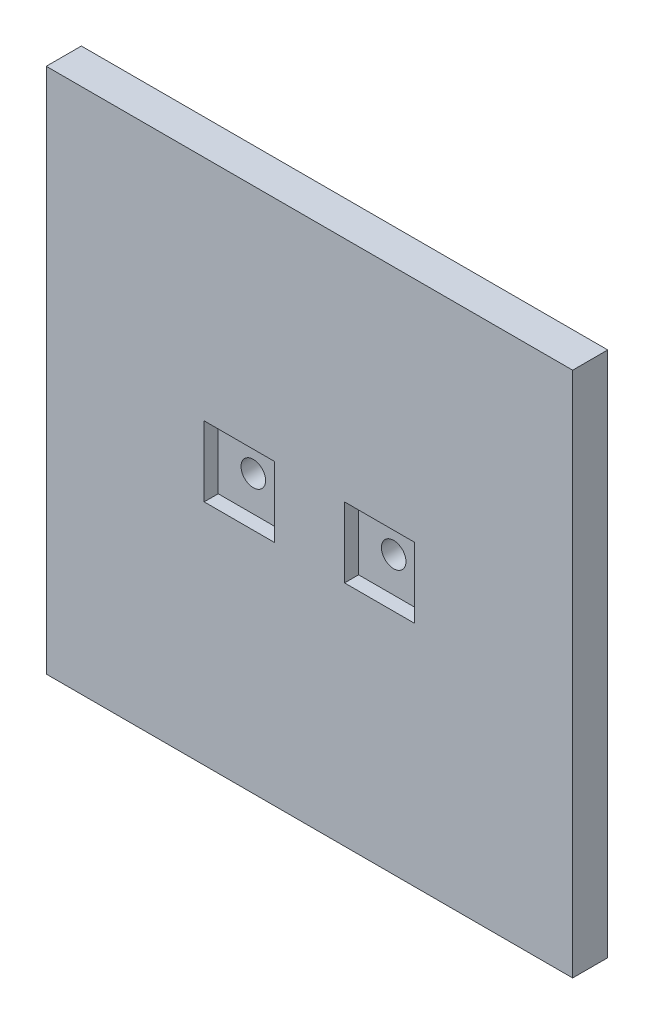
ISO-10303-21;
HEADER;
FILE_DESCRIPTION(('STEP AP214'),'2;1');
FILE_NAME('part.step','',(''),(''),'','','');
FILE_SCHEMA(('AUTOMOTIVE_DESIGN { 1 0 10303 214 1 1 1 1 }'));
ENDSEC;
DATA;
#1=APPLICATION_CONTEXT('core data for automotive mechanical design processes');
#2=APPLICATION_PROTOCOL_DEFINITION('international standard','automotive_design',2000,#1);
#3=PRODUCT_CONTEXT('',#1,'mechanical');
#4=PRODUCT('Part','Part','',(#3));
#5=PRODUCT_RELATED_PRODUCT_CATEGORY('part','',(#4));
#6=PRODUCT_DEFINITION_FORMATION('','',#4);
#7=PRODUCT_DEFINITION_CONTEXT('part definition',#1,'design');
#8=PRODUCT_DEFINITION('design','',#6,#7);
#9=PRODUCT_DEFINITION_SHAPE('','',#8);
#10=(LENGTH_UNIT() NAMED_UNIT(*) SI_UNIT(.MILLI.,.METRE.));
#11=(NAMED_UNIT(*) PLANE_ANGLE_UNIT() SI_UNIT($,.RADIAN.));
#12=(NAMED_UNIT(*) SI_UNIT($,.STERADIAN.) SOLID_ANGLE_UNIT());
#13=UNCERTAINTY_MEASURE_WITH_UNIT(LENGTH_MEASURE(1.E-05),#10,'distance_accuracy_value','');
#14=(GEOMETRIC_REPRESENTATION_CONTEXT(3) GLOBAL_UNCERTAINTY_ASSIGNED_CONTEXT((#13)) GLOBAL_UNIT_ASSIGNED_CONTEXT((#10,
#11,#12)) REPRESENTATION_CONTEXT('',''));
#15=CARTESIAN_POINT('',(0.,0.,0.));
#16=DIRECTION('',(0.,0.,1.));
#17=DIRECTION('',(1.,0.,0.));
#18=AXIS2_PLACEMENT_3D('',#15,#16,#17);
#19=CARTESIAN_POINT('',(5.,0.,5.));
#20=DIRECTION('',(-1.,0.,0.));
#21=DIRECTION('',(0.,0.,1.));
#22=AXIS2_PLACEMENT_3D('',#19,#20,#21);
#23=PLANE('',#22);
#24=DIRECTION('',(0.,0.,-1.));
#25=VECTOR('',#24,1.);
#26=CARTESIAN_POINT('',(5.,-5.,5.));
#27=LINE('',#26,#25);
#28=CARTESIAN_POINT('',(5.,-5.,5.));
#29=VERTEX_POINT('',#28);
#30=CARTESIAN_POINT('',(5.,-5.,3.));
#31=VERTEX_POINT('',#30);
#32=EDGE_CURVE('E220',#29,#31,#27,.T.);
#33=ORIENTED_EDGE('',*,*,#32,.T.);
#34=DIRECTION('',(0.,1.,0.));
#35=VECTOR('',#34,1.);
#36=CARTESIAN_POINT('',(5.,0.,3.));
#37=LINE('',#36,#35);
#38=CARTESIAN_POINT('',(5.,5.,3.));
#39=VERTEX_POINT('',#38);
#40=EDGE_CURVE('E58',#31,#39,#37,.T.);
#41=ORIENTED_EDGE('',*,*,#40,.T.);
#42=DIRECTION('',(0.,0.,-1.));
#43=VECTOR('',#42,1.);
#44=CARTESIAN_POINT('',(5.,5.,5.));
#45=LINE('',#44,#43);
#46=CARTESIAN_POINT('',(5.,5.,5.));
#47=VERTEX_POINT('',#46);
#48=EDGE_CURVE('E11',#47,#39,#45,.T.);
#49=ORIENTED_EDGE('',*,*,#48,.F.);
#50=DIRECTION('',(0.,1.,0.));
#51=VECTOR('',#50,1.);
#52=CARTESIAN_POINT('',(5.,0.,5.));
#53=LINE('',#52,#51);
#54=EDGE_CURVE('E206',#29,#47,#53,.T.);
#55=ORIENTED_EDGE('',*,*,#54,.F.);
#56=EDGE_LOOP('',(#33,#41,#49,#55));
#57=FACE_BOUND('',#56,.T.);
#58=ADVANCED_FACE('F41',(#57),#23,.F.);
#59=CARTESIAN_POINT('',(0.,5.,5.));
#60=DIRECTION('',(0.,-1.,0.));
#61=DIRECTION('',(1.,0.,0.));
#62=AXIS2_PLACEMENT_3D('',#59,#60,#61);
#63=PLANE('',#62);
#64=DIRECTION('',(1.,0.,0.));
#65=VECTOR('',#64,1.);
#66=CARTESIAN_POINT('',(0.,5.,3.));
#67=LINE('',#66,#65);
#68=CARTESIAN_POINT('',(15.,5.,3.));
#69=VERTEX_POINT('',#68);
#70=EDGE_CURVE('E64',#39,#69,#67,.T.);
#71=ORIENTED_EDGE('',*,*,#70,.T.);
#72=DIRECTION('',(0.,0.,-1.));
#73=VECTOR('',#72,1.);
#74=CARTESIAN_POINT('',(15.,5.,5.));
#75=LINE('',#74,#73);
#76=CARTESIAN_POINT('',(15.,5.,5.));
#77=VERTEX_POINT('',#76);
#78=EDGE_CURVE('E50',#77,#69,#75,.T.);
#79=ORIENTED_EDGE('',*,*,#78,.F.);
#80=DIRECTION('',(-1.,0.,0.));
#81=VECTOR('',#80,1.);
#82=CARTESIAN_POINT('',(0.,5.,5.));
#83=LINE('',#82,#81);
#84=EDGE_CURVE('E188',#77,#47,#83,.T.);
#85=ORIENTED_EDGE('',*,*,#84,.T.);
#86=ORIENTED_EDGE('',*,*,#48,.T.);
#87=EDGE_LOOP('',(#71,#79,#85,#86));
#88=FACE_BOUND('',#87,.T.);
#89=ADVANCED_FACE('F255',(#88),#63,.T.);
#90=CARTESIAN_POINT('',(15.,0.,5.));
#91=DIRECTION('',(1.,0.,0.));
#92=DIRECTION('',(0.,0.,-1.));
#93=AXIS2_PLACEMENT_3D('',#90,#91,#92);
#94=PLANE('',#93);
#95=ORIENTED_EDGE('',*,*,#78,.T.);
#96=DIRECTION('',(0.,-1.,0.));
#97=VECTOR('',#96,1.);
#98=CARTESIAN_POINT('',(15.,0.,3.));
#99=LINE('',#98,#97);
#100=CARTESIAN_POINT('',(15.,-5.,3.));
#101=VERTEX_POINT('',#100);
#102=EDGE_CURVE('E173',#69,#101,#99,.T.);
#103=ORIENTED_EDGE('',*,*,#102,.T.);
#104=DIRECTION('',(0.,0.,-1.));
#105=VECTOR('',#104,1.);
#106=CARTESIAN_POINT('',(15.,-5.,5.));
#107=LINE('',#106,#105);
#108=CARTESIAN_POINT('',(15.,-5.,5.));
#109=VERTEX_POINT('',#108);
#110=EDGE_CURVE('E222',#109,#101,#107,.T.);
#111=ORIENTED_EDGE('',*,*,#110,.F.);
#112=DIRECTION('',(0.,-1.,0.));
#113=VECTOR('',#112,1.);
#114=CARTESIAN_POINT('',(15.,0.,5.));
#115=LINE('',#114,#113);
#116=EDGE_CURVE('E208',#77,#109,#115,.T.);
#117=ORIENTED_EDGE('',*,*,#116,.F.);
#118=EDGE_LOOP('',(#95,#103,#111,#117));
#119=FACE_BOUND('',#118,.T.);
#120=ADVANCED_FACE('F260',(#119),#94,.F.);
#121=CARTESIAN_POINT('',(37.5,0.,5.));
#122=DIRECTION('',(1.,0.,0.));
#123=DIRECTION('',(0.,1.,0.));
#124=AXIS2_PLACEMENT_3D('',#121,#122,#123);
#125=PLANE('',#124);
#126=DIRECTION('',(0.,-1.,0.));
#127=VECTOR('',#126,1.);
#128=CARTESIAN_POINT('',(37.5,0.,0.));
#129=LINE('',#128,#127);
#130=CARTESIAN_POINT('',(37.5,37.5,0.));
#131=VERTEX_POINT('',#130);
#132=CARTESIAN_POINT('',(37.5,-37.5,0.));
#133=VERTEX_POINT('',#132);
#134=EDGE_CURVE('E166',#131,#133,#129,.T.);
#135=ORIENTED_EDGE('',*,*,#134,.F.);
#136=DIRECTION('',(0.,0.,-1.));
#137=VECTOR('',#136,1.);
#138=CARTESIAN_POINT('',(37.5,37.5,5.));
#139=LINE('',#138,#137);
#140=CARTESIAN_POINT('',(37.5,37.5,5.));
#141=VERTEX_POINT('',#140);
#142=EDGE_CURVE('E223',#141,#131,#139,.T.);
#143=ORIENTED_EDGE('',*,*,#142,.F.);
#144=DIRECTION('',(0.,-1.,0.));
#145=VECTOR('',#144,1.);
#146=CARTESIAN_POINT('',(37.5,0.,5.));
#147=LINE('',#146,#145);
#148=CARTESIAN_POINT('',(37.5,-37.5,5.));
#149=VERTEX_POINT('',#148);
#150=EDGE_CURVE('E195',#141,#149,#147,.T.);
#151=ORIENTED_EDGE('',*,*,#150,.T.);
#152=DIRECTION('',(0.,0.,-1.));
#153=VECTOR('',#152,1.);
#154=CARTESIAN_POINT('',(37.5,-37.5,5.));
#155=LINE('',#154,#153);
#156=EDGE_CURVE('E226',#149,#133,#155,.T.);
#157=ORIENTED_EDGE('',*,*,#156,.T.);
#158=EDGE_LOOP('',(#135,#143,#151,#157));
#159=FACE_BOUND('',#158,.T.);
#160=ADVANCED_FACE('F297',(#159),#125,.T.);
#161=CARTESIAN_POINT('',(0.,37.5,5.));
#162=DIRECTION('',(0.,1.,0.));
#163=DIRECTION('',(0.,0.,1.));
#164=AXIS2_PLACEMENT_3D('',#161,#162,#163);
#165=PLANE('',#164);
#166=DIRECTION('',(1.,0.,0.));
#167=VECTOR('',#166,1.);
#168=CARTESIAN_POINT('',(0.,37.5,0.));
#169=LINE('',#168,#167);
#170=CARTESIAN_POINT('',(-37.5,37.5,0.));
#171=VERTEX_POINT('',#170);
#172=EDGE_CURVE('E212',#171,#131,#169,.T.);
#173=ORIENTED_EDGE('',*,*,#172,.F.);
#174=DIRECTION('',(0.,0.,-1.));
#175=VECTOR('',#174,1.);
#176=CARTESIAN_POINT('',(-37.5,37.5,5.));
#177=LINE('',#176,#175);
#178=CARTESIAN_POINT('',(-37.5,37.5,5.));
#179=VERTEX_POINT('',#178);
#180=EDGE_CURVE('E231',#179,#171,#177,.T.);
#181=ORIENTED_EDGE('',*,*,#180,.F.);
#182=DIRECTION('',(1.,0.,0.));
#183=VECTOR('',#182,1.);
#184=CARTESIAN_POINT('',(0.,37.5,5.));
#185=LINE('',#184,#183);
#186=EDGE_CURVE('E198',#179,#141,#185,.T.);
#187=ORIENTED_EDGE('',*,*,#186,.T.);
#188=ORIENTED_EDGE('',*,*,#142,.T.);
#189=EDGE_LOOP('',(#173,#181,#187,#188));
#190=FACE_BOUND('',#189,.T.);
#191=ADVANCED_FACE('F293',(#190),#165,.T.);
#192=CARTESIAN_POINT('',(-37.5,0.,5.));
#193=DIRECTION('',(1.,0.,0.));
#194=DIRECTION('',(0.,1.,0.));
#195=AXIS2_PLACEMENT_3D('',#192,#193,#194);
#196=PLANE('',#195);
#197=DIRECTION('',(0.,-1.,0.));
#198=VECTOR('',#197,1.);
#199=CARTESIAN_POINT('',(-37.5,0.,0.));
#200=LINE('',#199,#198);
#201=CARTESIAN_POINT('',(-37.5,-37.5,0.));
#202=VERTEX_POINT('',#201);
#203=EDGE_CURVE('E215',#171,#202,#200,.T.);
#204=ORIENTED_EDGE('',*,*,#203,.T.);
#205=DIRECTION('',(0.,0.,-1.));
#206=VECTOR('',#205,1.);
#207=CARTESIAN_POINT('',(-37.5,-37.5,5.));
#208=LINE('',#207,#206);
#209=CARTESIAN_POINT('',(-37.5,-37.5,5.));
#210=VERTEX_POINT('',#209);
#211=EDGE_CURVE('E228',#210,#202,#208,.T.);
#212=ORIENTED_EDGE('',*,*,#211,.F.);
#213=DIRECTION('',(0.,-1.,0.));
#214=VECTOR('',#213,1.);
#215=CARTESIAN_POINT('',(-37.5,0.,5.));
#216=LINE('',#215,#214);
#217=EDGE_CURVE('E201',#179,#210,#216,.T.);
#218=ORIENTED_EDGE('',*,*,#217,.F.);
#219=ORIENTED_EDGE('',*,*,#180,.T.);
#220=EDGE_LOOP('',(#204,#212,#218,#219));
#221=FACE_BOUND('',#220,.T.);
#222=ADVANCED_FACE('F290',(#221),#196,.F.);
#223=DIRECTION('',(-1.,0.,0.));
#224=VECTOR('',#223,1.);
#225=CARTESIAN_POINT('',(0.,5.,3.));
#226=LINE('',#225,#224);
#227=CARTESIAN_POINT('',(-5.,5.,3.));
#228=VERTEX_POINT('',#227);
#229=CARTESIAN_POINT('',(-15.,5.,3.));
#230=VERTEX_POINT('',#229);
#231=EDGE_CURVE('E157',#228,#230,#226,.T.);
#232=ORIENTED_EDGE('',*,*,#231,.F.);
#233=DIRECTION('',(0.,0.,-1.));
#234=VECTOR('',#233,1.);
#235=CARTESIAN_POINT('',(-5.,5.,5.));
#236=LINE('',#235,#234);
#237=CARTESIAN_POINT('',(-5.,5.,5.));
#238=VERTEX_POINT('',#237);
#239=EDGE_CURVE('E45',#238,#228,#236,.T.);
#240=ORIENTED_EDGE('',*,*,#239,.F.);
#241=CARTESIAN_POINT('',(-15.,5.,5.));
#242=VERTEX_POINT('',#241);
#243=EDGE_CURVE('E183',#238,#242,#83,.T.);
#244=ORIENTED_EDGE('',*,*,#243,.T.);
#245=DIRECTION('',(0.,0.,-1.));
#246=VECTOR('',#245,1.);
#247=CARTESIAN_POINT('',(-15.,5.,5.));
#248=LINE('',#247,#246);
#249=EDGE_CURVE('E144',#242,#230,#248,.T.);
#250=ORIENTED_EDGE('',*,*,#249,.T.);
#251=EDGE_LOOP('',(#232,#240,#244,#250));
#252=FACE_BOUND('',#251,.T.);
#253=ADVANCED_FACE('F239',(#252),#63,.T.);
#254=CARTESIAN_POINT('',(-5.,0.,5.));
#255=DIRECTION('',(-1.,0.,0.));
#256=DIRECTION('',(0.,0.,1.));
#257=AXIS2_PLACEMENT_3D('',#254,#255,#256);
#258=PLANE('',#257);
#259=DIRECTION('',(0.,1.,0.));
#260=VECTOR('',#259,1.);
#261=CARTESIAN_POINT('',(-5.,0.,3.));
#262=LINE('',#261,#260);
#263=CARTESIAN_POINT('',(-5.,-5.,3.));
#264=VERTEX_POINT('',#263);
#265=EDGE_CURVE('E152',#264,#228,#262,.T.);
#266=ORIENTED_EDGE('',*,*,#265,.F.);
#267=DIRECTION('',(0.,0.,-1.));
#268=VECTOR('',#267,1.);
#269=CARTESIAN_POINT('',(-5.,-5.,5.));
#270=LINE('',#269,#268);
#271=CARTESIAN_POINT('',(-5.,-5.,5.));
#272=VERTEX_POINT('',#271);
#273=EDGE_CURVE('E143',#272,#264,#270,.T.);
#274=ORIENTED_EDGE('',*,*,#273,.F.);
#275=DIRECTION('',(0.,1.,0.));
#276=VECTOR('',#275,1.);
#277=CARTESIAN_POINT('',(-5.,0.,5.));
#278=LINE('',#277,#276);
#279=EDGE_CURVE('E186',#272,#238,#278,.T.);
#280=ORIENTED_EDGE('',*,*,#279,.T.);
#281=ORIENTED_EDGE('',*,*,#239,.T.);
#282=EDGE_LOOP('',(#266,#274,#280,#281));
#283=FACE_BOUND('',#282,.T.);
#284=ADVANCED_FACE('F43',(#283),#258,.T.);
#285=CARTESIAN_POINT('',(0.,-5.,5.));
#286=DIRECTION('',(0.,1.,0.));
#287=DIRECTION('',(0.,0.,1.));
#288=AXIS2_PLACEMENT_3D('',#285,#286,#287);
#289=PLANE('',#288);
#290=DIRECTION('',(-1.,0.,0.));
#291=VECTOR('',#290,1.);
#292=CARTESIAN_POINT('',(0.,-5.,3.));
#293=LINE('',#292,#291);
#294=CARTESIAN_POINT('',(-15.,-5.,3.));
#295=VERTEX_POINT('',#294);
#296=EDGE_CURVE('E148',#264,#295,#293,.T.);
#297=ORIENTED_EDGE('',*,*,#296,.T.);
#298=DIRECTION('',(0.,0.,-1.));
#299=VECTOR('',#298,1.);
#300=CARTESIAN_POINT('',(-15.,-5.,5.));
#301=LINE('',#300,#299);
#302=CARTESIAN_POINT('',(-15.,-5.,5.));
#303=VERTEX_POINT('',#302);
#304=EDGE_CURVE('E132',#303,#295,#301,.T.);
#305=ORIENTED_EDGE('',*,*,#304,.F.);
#306=DIRECTION('',(1.,0.,0.));
#307=VECTOR('',#306,1.);
#308=CARTESIAN_POINT('',(0.,-5.,5.));
#309=LINE('',#308,#307);
#310=EDGE_CURVE('E191',#303,#272,#309,.T.);
#311=ORIENTED_EDGE('',*,*,#310,.T.);
#312=ORIENTED_EDGE('',*,*,#273,.T.);
#313=EDGE_LOOP('',(#297,#305,#311,#312));
#314=FACE_BOUND('',#313,.T.);
#315=ADVANCED_FACE('F149',(#314),#289,.T.);
#316=CARTESIAN_POINT('',(0.,-37.5,5.));
#317=DIRECTION('',(0.,1.,0.));
#318=DIRECTION('',(0.,0.,1.));
#319=AXIS2_PLACEMENT_3D('',#316,#317,#318);
#320=PLANE('',#319);
#321=DIRECTION('',(1.,0.,0.));
#322=VECTOR('',#321,1.);
#323=CARTESIAN_POINT('',(0.,-37.5,0.));
#324=LINE('',#323,#322);
#325=EDGE_CURVE('E187',#202,#133,#324,.T.);
#326=ORIENTED_EDGE('',*,*,#325,.T.);
#327=ORIENTED_EDGE('',*,*,#156,.F.);
#328=DIRECTION('',(1.,0.,0.));
#329=VECTOR('',#328,1.);
#330=CARTESIAN_POINT('',(0.,-37.5,5.));
#331=LINE('',#330,#329);
#332=EDGE_CURVE('E204',#210,#149,#331,.T.);
#333=ORIENTED_EDGE('',*,*,#332,.F.);
#334=ORIENTED_EDGE('',*,*,#211,.T.);
#335=EDGE_LOOP('',(#326,#327,#333,#334));
#336=FACE_BOUND('',#335,.T.);
#337=ADVANCED_FACE('F286',(#336),#320,.F.);
#338=CARTESIAN_POINT('',(-15.,0.,5.));
#339=DIRECTION('',(1.,0.,0.));
#340=DIRECTION('',(0.,1.,0.));
#341=AXIS2_PLACEMENT_3D('',#338,#339,#340);
#342=PLANE('',#341);
#343=DIRECTION('',(0.,-1.,0.));
#344=VECTOR('',#343,1.);
#345=CARTESIAN_POINT('',(-15.,0.,3.));
#346=LINE('',#345,#344);
#347=EDGE_CURVE('E136',#230,#295,#346,.T.);
#348=ORIENTED_EDGE('',*,*,#347,.F.);
#349=ORIENTED_EDGE('',*,*,#249,.F.);
#350=DIRECTION('',(0.,-1.,0.));
#351=VECTOR('',#350,1.);
#352=CARTESIAN_POINT('',(-15.,0.,5.));
#353=LINE('',#352,#351);
#354=EDGE_CURVE('E139',#242,#303,#353,.T.);
#355=ORIENTED_EDGE('',*,*,#354,.T.);
#356=ORIENTED_EDGE('',*,*,#304,.T.);
#357=EDGE_LOOP('',(#348,#349,#355,#356));
#358=FACE_BOUND('',#357,.T.);
#359=ADVANCED_FACE('F134',(#358),#342,.T.);
#360=DIRECTION('',(1.,0.,0.));
#361=VECTOR('',#360,1.);
#362=CARTESIAN_POINT('',(0.,-5.,3.));
#363=LINE('',#362,#361);
#364=EDGE_CURVE('E169',#31,#101,#363,.T.);
#365=ORIENTED_EDGE('',*,*,#364,.F.);
#366=ORIENTED_EDGE('',*,*,#32,.F.);
#367=EDGE_CURVE('E193',#29,#109,#309,.T.);
#368=ORIENTED_EDGE('',*,*,#367,.T.);
#369=ORIENTED_EDGE('',*,*,#110,.T.);
#370=EDGE_LOOP('',(#365,#366,#368,#369));
#371=FACE_BOUND('',#370,.T.);
#372=ADVANCED_FACE('F245',(#371),#289,.T.);
#373=CARTESIAN_POINT('',(0.,0.,5.));
#374=DIRECTION('',(0.,0.,1.));
#375=DIRECTION('',(1.,0.,0.));
#376=AXIS2_PLACEMENT_3D('',#373,#374,#375);
#377=PLANE('',#376);
#378=ORIENTED_EDGE('',*,*,#243,.F.);
#379=ORIENTED_EDGE('',*,*,#279,.F.);
#380=ORIENTED_EDGE('',*,*,#310,.F.);
#381=ORIENTED_EDGE('',*,*,#354,.F.);
#382=EDGE_LOOP('',(#378,#379,#380,#381));
#383=FACE_BOUND('',#382,.T.);
#384=ORIENTED_EDGE('',*,*,#150,.F.);
#385=ORIENTED_EDGE('',*,*,#186,.F.);
#386=ORIENTED_EDGE('',*,*,#217,.T.);
#387=ORIENTED_EDGE('',*,*,#332,.T.);
#388=EDGE_LOOP('',(#384,#385,#386,#387));
#389=FACE_BOUND('',#388,.T.);
#390=ORIENTED_EDGE('',*,*,#54,.T.);
#391=ORIENTED_EDGE('',*,*,#84,.F.);
#392=ORIENTED_EDGE('',*,*,#116,.T.);
#393=ORIENTED_EDGE('',*,*,#367,.F.);
#394=EDGE_LOOP('',(#390,#391,#392,#393));
#395=FACE_BOUND('',#394,.T.);
#396=ADVANCED_FACE('F241',(#383,#389,#395),#377,.T.);
#397=CARTESIAN_POINT('',(0.,0.,0.));
#398=DIRECTION('',(0.,0.,1.));
#399=DIRECTION('',(1.,0.,0.));
#400=AXIS2_PLACEMENT_3D('',#397,#398,#399);
#401=PLANE('',#400);
#402=ORIENTED_EDGE('',*,*,#134,.T.);
#403=ORIENTED_EDGE('',*,*,#325,.F.);
#404=ORIENTED_EDGE('',*,*,#203,.F.);
#405=ORIENTED_EDGE('',*,*,#172,.T.);
#406=EDGE_LOOP('',(#402,#403,#404,#405));
#407=FACE_BOUND('',#406,.T.);
#408=CARTESIAN_POINT('',(10.,0.,0.));
#409=DIRECTION('',(0.,0.,1.));
#410=DIRECTION('',(1.,0.,0.));
#411=AXIS2_PLACEMENT_3D('',#408,#409,#410);
#412=CIRCLE('',#411,1.75);
#413=CARTESIAN_POINT('',(11.75,0.,0.));
#414=VERTEX_POINT('',#413);
#415=EDGE_CURVE('E174',#414,#414,#412,.T.);
#416=ORIENTED_EDGE('',*,*,#415,.T.);
#417=EDGE_LOOP('',(#416));
#418=FACE_BOUND('',#417,.T.);
#419=CARTESIAN_POINT('',(-10.,0.,0.));
#420=DIRECTION('',(0.,0.,1.));
#421=DIRECTION('',(1.,0.,0.));
#422=AXIS2_PLACEMENT_3D('',#419,#420,#421);
#423=CIRCLE('',#422,1.75);
#424=CARTESIAN_POINT('',(-8.25,0.,0.));
#425=VERTEX_POINT('',#424);
#426=EDGE_CURVE('E159',#425,#425,#423,.F.);
#427=ORIENTED_EDGE('',*,*,#426,.F.);
#428=EDGE_LOOP('',(#427));
#429=FACE_BOUND('',#428,.T.);
#430=ADVANCED_FACE('F244',(#407,#418,#429),#401,.F.);
#431=CARTESIAN_POINT('',(10.,0.,3.));
#432=DIRECTION('',(0.,0.,-1.));
#433=DIRECTION('',(-1.,0.,0.));
#434=AXIS2_PLACEMENT_3D('',#431,#432,#433);
#435=CYLINDRICAL_SURFACE('',#434,1.75);
#436=CARTESIAN_POINT('',(10.,0.,3.));
#437=DIRECTION('',(0.,0.,1.));
#438=DIRECTION('',(1.,0.,0.));
#439=AXIS2_PLACEMENT_3D('',#436,#437,#438);
#440=CIRCLE('',#439,1.75);
#441=CARTESIAN_POINT('',(11.75,0.,3.));
#442=VERTEX_POINT('',#441);
#443=EDGE_CURVE('E170',#442,#442,#440,.T.);
#444=ORIENTED_EDGE('',*,*,#443,.T.);
#445=EDGE_LOOP('',(#444));
#446=FACE_BOUND('',#445,.T.);
#447=ORIENTED_EDGE('',*,*,#415,.F.);
#448=EDGE_LOOP('',(#447));
#449=FACE_BOUND('',#448,.T.);
#450=ADVANCED_FACE('F266',(#446,#449),#435,.F.);
#451=CARTESIAN_POINT('',(0.,0.,3.));
#452=DIRECTION('',(0.,0.,1.));
#453=DIRECTION('',(1.,0.,0.));
#454=AXIS2_PLACEMENT_3D('',#451,#452,#453);
#455=PLANE('',#454);
#456=ORIENTED_EDGE('',*,*,#443,.F.);
#457=EDGE_LOOP('',(#456));
#458=FACE_BOUND('',#457,.T.);
#459=ORIENTED_EDGE('',*,*,#102,.F.);
#460=ORIENTED_EDGE('',*,*,#70,.F.);
#461=ORIENTED_EDGE('',*,*,#40,.F.);
#462=ORIENTED_EDGE('',*,*,#364,.T.);
#463=EDGE_LOOP('',(#459,#460,#461,#462));
#464=FACE_BOUND('',#463,.T.);
#465=ADVANCED_FACE('F263',(#458,#464),#455,.T.);
#466=CARTESIAN_POINT('',(-10.,0.,3.));
#467=DIRECTION('',(0.,0.,-1.));
#468=DIRECTION('',(-1.,0.,0.));
#469=AXIS2_PLACEMENT_3D('',#466,#467,#468);
#470=CYLINDRICAL_SURFACE('',#469,1.75);
#471=CARTESIAN_POINT('',(-10.,0.,3.));
#472=DIRECTION('',(0.,0.,1.));
#473=DIRECTION('',(1.,0.,0.));
#474=AXIS2_PLACEMENT_3D('',#471,#472,#473);
#475=CIRCLE('',#474,1.75);
#476=CARTESIAN_POINT('',(-8.25,0.,3.));
#477=VERTEX_POINT('',#476);
#478=EDGE_CURVE('E163',#477,#477,#475,.F.);
#479=ORIENTED_EDGE('',*,*,#478,.F.);
#480=EDGE_LOOP('',(#479));
#481=FACE_BOUND('',#480,.T.);
#482=ORIENTED_EDGE('',*,*,#426,.T.);
#483=EDGE_LOOP('',(#482));
#484=FACE_BOUND('',#483,.T.);
#485=ADVANCED_FACE('F265',(#481,#484),#470,.F.);
#486=CARTESIAN_POINT('',(0.,0.,3.));
#487=DIRECTION('',(0.,0.,1.));
#488=DIRECTION('',(1.,0.,0.));
#489=AXIS2_PLACEMENT_3D('',#486,#487,#488);
#490=PLANE('',#489);
#491=ORIENTED_EDGE('',*,*,#231,.T.);
#492=ORIENTED_EDGE('',*,*,#347,.T.);
#493=ORIENTED_EDGE('',*,*,#296,.F.);
#494=ORIENTED_EDGE('',*,*,#265,.T.);
#495=EDGE_LOOP('',(#491,#492,#493,#494));
#496=FACE_BOUND('',#495,.T.);
#497=ORIENTED_EDGE('',*,*,#478,.T.);
#498=EDGE_LOOP('',(#497));
#499=FACE_BOUND('',#498,.T.);
#500=ADVANCED_FACE('F155',(#496,#499),#490,.T.);
#501=CLOSED_SHELL('',(#58,#89,#120,#160,#191,#222,#253,#284,#315,#337,#359,#372,#396,#430,#450,
#465,#485,#500));
#502=MANIFOLD_SOLID_BREP('B2',#501);
#503=ADVANCED_BREP_SHAPE_REPRESENTATION('',(#18,#502),#14);
#504=SHAPE_DEFINITION_REPRESENTATION(#9,#503);
ENDSEC;
END-ISO-10303-21;
